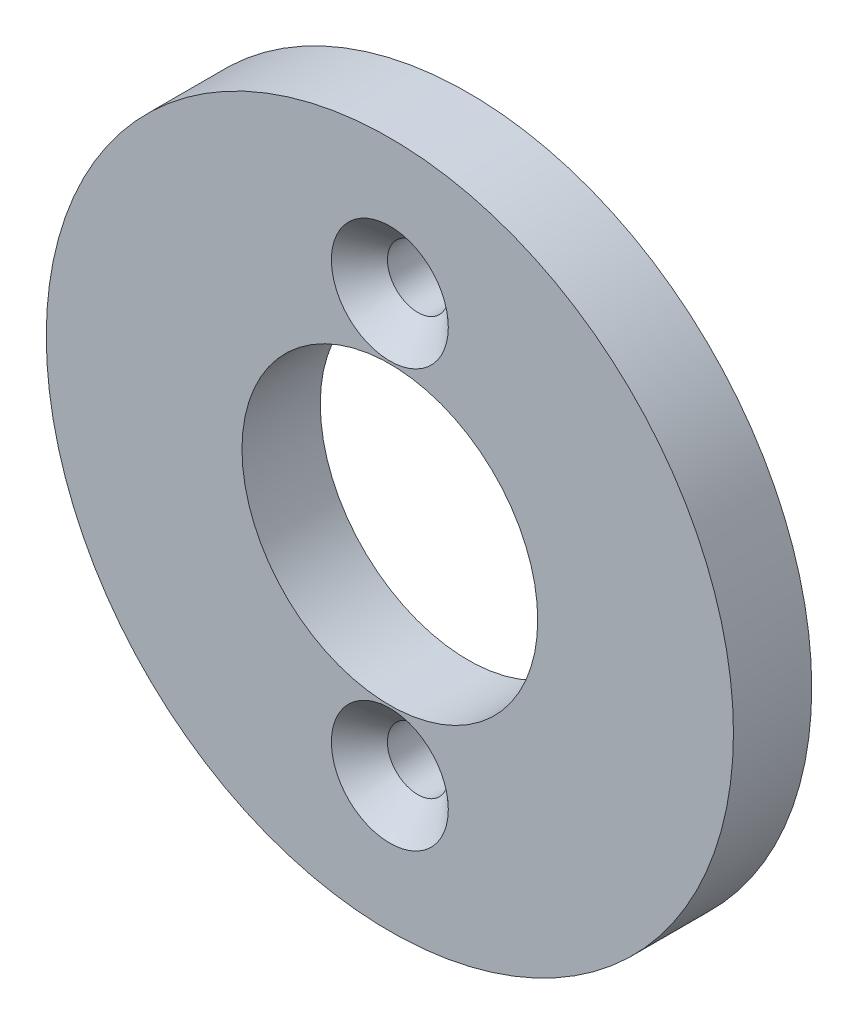
ISO-10303-21;
HEADER;
FILE_DESCRIPTION(('STEP AP214'),'2;1');
FILE_NAME('part.step','',(''),(''),'','','');
FILE_SCHEMA(('AUTOMOTIVE_DESIGN { 1 0 10303 214 1 1 1 1 }'));
ENDSEC;
DATA;
#1=APPLICATION_CONTEXT('core data for automotive mechanical design processes');
#2=APPLICATION_PROTOCOL_DEFINITION('international standard','automotive_design',2000,#1);
#3=PRODUCT_CONTEXT('',#1,'mechanical');
#4=PRODUCT('Part','Part','',(#3));
#5=PRODUCT_RELATED_PRODUCT_CATEGORY('part','',(#4));
#6=PRODUCT_DEFINITION_FORMATION('','',#4);
#7=PRODUCT_DEFINITION_CONTEXT('part definition',#1,'design');
#8=PRODUCT_DEFINITION('design','',#6,#7);
#9=PRODUCT_DEFINITION_SHAPE('','',#8);
#10=(LENGTH_UNIT() NAMED_UNIT(*) SI_UNIT(.MILLI.,.METRE.));
#11=(NAMED_UNIT(*) PLANE_ANGLE_UNIT() SI_UNIT($,.RADIAN.));
#12=(NAMED_UNIT(*) SI_UNIT($,.STERADIAN.) SOLID_ANGLE_UNIT());
#13=UNCERTAINTY_MEASURE_WITH_UNIT(LENGTH_MEASURE(1.E-05),#10,'distance_accuracy_value','');
#14=(GEOMETRIC_REPRESENTATION_CONTEXT(3) GLOBAL_UNCERTAINTY_ASSIGNED_CONTEXT((#13)) GLOBAL_UNIT_ASSIGNED_CONTEXT((#10,
#11,#12)) REPRESENTATION_CONTEXT('',''));
#15=CARTESIAN_POINT('',(0.,0.,0.));
#16=DIRECTION('',(0.,0.,1.));
#17=DIRECTION('',(1.,0.,0.));
#18=AXIS2_PLACEMENT_3D('',#15,#16,#17);
#19=CARTESIAN_POINT('',(0.,24.,-1.2E-05));
#20=DIRECTION('',(0.,0.,1.));
#21=DIRECTION('',(1.,0.,0.));
#22=AXIS2_PLACEMENT_3D('',#19,#20,#21);
#23=CYLINDRICAL_SURFACE('',#22,3.5);
#24=CARTESIAN_POINT('',(0.,24.,0.));
#25=DIRECTION('',(0.,0.,1.));
#26=DIRECTION('',(1.,0.,0.));
#27=AXIS2_PLACEMENT_3D('',#24,#25,#26);
#28=CIRCLE('',#27,3.5);
#29=CARTESIAN_POINT('',(3.5,24.,0.));
#30=VERTEX_POINT('',#29);
#31=EDGE_CURVE('E57',#30,#30,#28,.T.);
#32=CARTESIAN_POINT('',(0.,24.,5.78));
#33=DIRECTION('',(0.,0.,1.));
#34=DIRECTION('',(1.,0.,0.));
#35=AXIS2_PLACEMENT_3D('',#32,#33,#34);
#36=CIRCLE('',#35,3.5);
#37=CARTESIAN_POINT('',(3.5,24.,5.78));
#38=VERTEX_POINT('',#37);
#39=EDGE_CURVE('E79',#38,#38,#36,.T.);
#40=CARTESIAN_POINT('',(3.5,24.,0.));
#41=CARTESIAN_POINT('',(3.5,24.,0.0602083333333333));
#42=CARTESIAN_POINT('',(3.5,24.,0.120416666666667));
#43=CARTESIAN_POINT('',(3.5,24.,0.240833333333333));
#44=CARTESIAN_POINT('',(3.5,24.,0.301041666666667));
#45=CARTESIAN_POINT('',(3.5,24.,0.421458333333333));
#46=CARTESIAN_POINT('',(3.5,24.,0.481666666666667));
#47=CARTESIAN_POINT('',(3.5,24.,0.602083333333333));
#48=CARTESIAN_POINT('',(3.5,24.,0.662291666666667));
#49=CARTESIAN_POINT('',(3.5,24.,0.782708333333333));
#50=CARTESIAN_POINT('',(3.5,24.,0.842916666666667));
#51=CARTESIAN_POINT('',(3.5,24.,0.963333333333333));
#52=CARTESIAN_POINT('',(3.5,24.,1.02354166666667));
#53=CARTESIAN_POINT('',(3.5,24.,1.14395833333333));
#54=CARTESIAN_POINT('',(3.5,24.,1.20416666666667));
#55=CARTESIAN_POINT('',(3.5,24.,1.32458333333333));
#56=CARTESIAN_POINT('',(3.5,24.,1.38479166666667));
#57=CARTESIAN_POINT('',(3.5,24.,1.50520833333333));
#58=CARTESIAN_POINT('',(3.5,24.,1.56541666666667));
#59=CARTESIAN_POINT('',(3.5,24.,1.68583333333333));
#60=CARTESIAN_POINT('',(3.5,24.,1.74604166666667));
#61=CARTESIAN_POINT('',(3.5,24.,1.86645833333333));
#62=CARTESIAN_POINT('',(3.5,24.,1.92666666666667));
#63=CARTESIAN_POINT('',(3.5,24.,2.04708333333333));
#64=CARTESIAN_POINT('',(3.5,24.,2.10729166666667));
#65=CARTESIAN_POINT('',(3.5,24.,2.22770833333333));
#66=CARTESIAN_POINT('',(3.5,24.,2.28791666666667));
#67=CARTESIAN_POINT('',(3.5,24.,2.40833333333333));
#68=CARTESIAN_POINT('',(3.5,24.,2.46854166666667));
#69=CARTESIAN_POINT('',(3.5,24.,2.58895833333333));
#70=CARTESIAN_POINT('',(3.5,24.,2.64916666666667));
#71=CARTESIAN_POINT('',(3.5,24.,2.76958333333333));
#72=CARTESIAN_POINT('',(3.5,24.,2.82979166666667));
#73=CARTESIAN_POINT('',(3.5,24.,2.95020833333333));
#74=CARTESIAN_POINT('',(3.5,24.,3.01041666666667));
#75=CARTESIAN_POINT('',(3.5,24.,3.13083333333333));
#76=CARTESIAN_POINT('',(3.5,24.,3.19104166666667));
#77=CARTESIAN_POINT('',(3.5,24.,3.31145833333333));
#78=CARTESIAN_POINT('',(3.5,24.,3.37166666666667));
#79=CARTESIAN_POINT('',(3.5,24.,3.49208333333333));
#80=CARTESIAN_POINT('',(3.5,24.,3.55229166666667));
#81=CARTESIAN_POINT('',(3.5,24.,3.67270833333333));
#82=CARTESIAN_POINT('',(3.5,24.,3.73291666666667));
#83=CARTESIAN_POINT('',(3.5,24.,3.85333333333333));
#84=CARTESIAN_POINT('',(3.5,24.,3.91354166666667));
#85=CARTESIAN_POINT('',(3.5,24.,4.03395833333333));
#86=CARTESIAN_POINT('',(3.5,24.,4.09416666666667));
#87=CARTESIAN_POINT('',(3.5,24.,4.21458333333333));
#88=CARTESIAN_POINT('',(3.5,24.,4.27479166666667));
#89=CARTESIAN_POINT('',(3.5,24.,4.39520833333333));
#90=CARTESIAN_POINT('',(3.5,24.,4.45541666666667));
#91=CARTESIAN_POINT('',(3.5,24.,4.57583333333333));
#92=CARTESIAN_POINT('',(3.5,24.,4.63604166666667));
#93=CARTESIAN_POINT('',(3.5,24.,4.75645833333333));
#94=CARTESIAN_POINT('',(3.5,24.,4.81666666666667));
#95=CARTESIAN_POINT('',(3.5,24.,4.93708333333333));
#96=CARTESIAN_POINT('',(3.5,24.,4.99729166666667));
#97=CARTESIAN_POINT('',(3.5,24.,5.11770833333333));
#98=CARTESIAN_POINT('',(3.5,24.,5.17791666666667));
#99=CARTESIAN_POINT('',(3.5,24.,5.29833333333333));
#100=CARTESIAN_POINT('',(3.5,24.,5.35854166666667));
#101=CARTESIAN_POINT('',(3.5,24.,5.47895833333333));
#102=CARTESIAN_POINT('',(3.5,24.,5.53916666666667));
#103=CARTESIAN_POINT('',(3.5,24.,5.65958333333333));
#104=CARTESIAN_POINT('',(3.5,24.,5.71979166666667));
#105=CARTESIAN_POINT('',(3.5,24.,5.78));
#106=B_SPLINE_CURVE_WITH_KNOTS('',3,(#40,#41,#42,#43,#44,#45,#46,#47,#48,#49,#50,#51,#52,#53,
#54,#55,#56,#57,#58,#59,#60,#61,#62,#63,#64,#65,#66,#67,#68,#69,#70,#71,#72,#73,#74,#75,#76,#77,
#78,#79,#80,#81,#82,#83,#84,#85,#86,#87,#88,#89,#90,#91,#92,#93,#94,#95,#96,#97,#98,#99,#100,
#101,#102,#103,#104,#105),.UNSPECIFIED.,.F.,.F.,(4,2,2,2,2,2,2,2,2,2,2,2,2,2,2,2,2,2,2,2,2,2,2,
2,2,2,2,2,2,2,2,2,4),(0.,0.180625,0.36125,0.541875,0.7225,0.903125,1.08375,1.264375,1.445,
1.625625,1.80625,1.986875,2.1675,2.348125,2.52875,2.709375,2.89,3.070625,3.25125,3.431875,
3.6125,3.793125,3.97375,4.154375,4.335,4.515625,4.69625,4.876875,5.0575,5.238125,5.41875,
5.599375,5.78),.UNSPECIFIED.);
#107=EDGE_CURVE('BSEAM37',#30,#38,#106,.T.);
#108=ORIENTED_EDGE('',*,*,#31,.F.);
#109=ORIENTED_EDGE('',*,*,#39,.T.);
#110=ORIENTED_EDGE('',*,*,#107,.T.);
#111=ORIENTED_EDGE('',*,*,#107,.F.);
#112=EDGE_LOOP('',(#108,#110,#109,#111));
#113=FACE_BOUND('',#112,.T.);
#114=ADVANCED_FACE('F37',(#113),#23,.F.);
#115=CARTESIAN_POINT('',(0.,-24.,-1.2E-05));
#116=DIRECTION('',(0.,0.,1.));
#117=DIRECTION('',(1.,0.,0.));
#118=AXIS2_PLACEMENT_3D('',#115,#116,#117);
#119=CYLINDRICAL_SURFACE('',#118,3.5);
#120=CARTESIAN_POINT('',(0.,-24.,0.));
#121=DIRECTION('',(0.,0.,1.));
#122=DIRECTION('',(1.,0.,0.));
#123=AXIS2_PLACEMENT_3D('',#120,#121,#122);
#124=CIRCLE('',#123,3.5);
#125=CARTESIAN_POINT('',(3.5,-24.,0.));
#126=VERTEX_POINT('',#125);
#127=EDGE_CURVE('E41',#126,#126,#124,.T.);
#128=CARTESIAN_POINT('',(0.,-24.,5.78));
#129=DIRECTION('',(0.,0.,1.));
#130=DIRECTION('',(1.,0.,0.));
#131=AXIS2_PLACEMENT_3D('',#128,#129,#130);
#132=CIRCLE('',#131,3.5);
#133=CARTESIAN_POINT('',(3.5,-24.,5.78));
#134=VERTEX_POINT('',#133);
#135=EDGE_CURVE('E72',#134,#134,#132,.T.);
#136=CARTESIAN_POINT('',(3.5,-24.,0.));
#137=CARTESIAN_POINT('',(3.5,-24.,0.0602083333333333));
#138=CARTESIAN_POINT('',(3.5,-24.,0.120416666666667));
#139=CARTESIAN_POINT('',(3.5,-24.,0.240833333333333));
#140=CARTESIAN_POINT('',(3.5,-24.,0.301041666666667));
#141=CARTESIAN_POINT('',(3.5,-24.,0.421458333333333));
#142=CARTESIAN_POINT('',(3.5,-24.,0.481666666666667));
#143=CARTESIAN_POINT('',(3.5,-24.,0.602083333333333));
#144=CARTESIAN_POINT('',(3.5,-24.,0.662291666666667));
#145=CARTESIAN_POINT('',(3.5,-24.,0.782708333333333));
#146=CARTESIAN_POINT('',(3.5,-24.,0.842916666666667));
#147=CARTESIAN_POINT('',(3.5,-24.,0.963333333333333));
#148=CARTESIAN_POINT('',(3.5,-24.,1.02354166666667));
#149=CARTESIAN_POINT('',(3.5,-24.,1.14395833333333));
#150=CARTESIAN_POINT('',(3.5,-24.,1.20416666666667));
#151=CARTESIAN_POINT('',(3.5,-24.,1.32458333333333));
#152=CARTESIAN_POINT('',(3.5,-24.,1.38479166666667));
#153=CARTESIAN_POINT('',(3.5,-24.,1.50520833333333));
#154=CARTESIAN_POINT('',(3.5,-24.,1.56541666666667));
#155=CARTESIAN_POINT('',(3.5,-24.,1.68583333333333));
#156=CARTESIAN_POINT('',(3.5,-24.,1.74604166666667));
#157=CARTESIAN_POINT('',(3.5,-24.,1.86645833333333));
#158=CARTESIAN_POINT('',(3.5,-24.,1.92666666666667));
#159=CARTESIAN_POINT('',(3.5,-24.,2.04708333333333));
#160=CARTESIAN_POINT('',(3.5,-24.,2.10729166666667));
#161=CARTESIAN_POINT('',(3.5,-24.,2.22770833333333));
#162=CARTESIAN_POINT('',(3.5,-24.,2.28791666666667));
#163=CARTESIAN_POINT('',(3.5,-24.,2.40833333333333));
#164=CARTESIAN_POINT('',(3.5,-24.,2.46854166666667));
#165=CARTESIAN_POINT('',(3.5,-24.,2.58895833333333));
#166=CARTESIAN_POINT('',(3.5,-24.,2.64916666666667));
#167=CARTESIAN_POINT('',(3.5,-24.,2.76958333333333));
#168=CARTESIAN_POINT('',(3.5,-24.,2.82979166666667));
#169=CARTESIAN_POINT('',(3.5,-24.,2.95020833333333));
#170=CARTESIAN_POINT('',(3.5,-24.,3.01041666666667));
#171=CARTESIAN_POINT('',(3.5,-24.,3.13083333333333));
#172=CARTESIAN_POINT('',(3.5,-24.,3.19104166666667));
#173=CARTESIAN_POINT('',(3.5,-24.,3.31145833333333));
#174=CARTESIAN_POINT('',(3.5,-24.,3.37166666666667));
#175=CARTESIAN_POINT('',(3.5,-24.,3.49208333333333));
#176=CARTESIAN_POINT('',(3.5,-24.,3.55229166666667));
#177=CARTESIAN_POINT('',(3.5,-24.,3.67270833333333));
#178=CARTESIAN_POINT('',(3.5,-24.,3.73291666666667));
#179=CARTESIAN_POINT('',(3.5,-24.,3.85333333333333));
#180=CARTESIAN_POINT('',(3.5,-24.,3.91354166666667));
#181=CARTESIAN_POINT('',(3.5,-24.,4.03395833333333));
#182=CARTESIAN_POINT('',(3.5,-24.,4.09416666666667));
#183=CARTESIAN_POINT('',(3.5,-24.,4.21458333333333));
#184=CARTESIAN_POINT('',(3.5,-24.,4.27479166666667));
#185=CARTESIAN_POINT('',(3.5,-24.,4.39520833333333));
#186=CARTESIAN_POINT('',(3.5,-24.,4.45541666666667));
#187=CARTESIAN_POINT('',(3.5,-24.,4.57583333333333));
#188=CARTESIAN_POINT('',(3.5,-24.,4.63604166666667));
#189=CARTESIAN_POINT('',(3.5,-24.,4.75645833333333));
#190=CARTESIAN_POINT('',(3.5,-24.,4.81666666666667));
#191=CARTESIAN_POINT('',(3.5,-24.,4.93708333333333));
#192=CARTESIAN_POINT('',(3.5,-24.,4.99729166666667));
#193=CARTESIAN_POINT('',(3.5,-24.,5.11770833333333));
#194=CARTESIAN_POINT('',(3.5,-24.,5.17791666666667));
#195=CARTESIAN_POINT('',(3.5,-24.,5.29833333333333));
#196=CARTESIAN_POINT('',(3.5,-24.,5.35854166666667));
#197=CARTESIAN_POINT('',(3.5,-24.,5.47895833333333));
#198=CARTESIAN_POINT('',(3.5,-24.,5.53916666666667));
#199=CARTESIAN_POINT('',(3.5,-24.,5.65958333333333));
#200=CARTESIAN_POINT('',(3.5,-24.,5.71979166666667));
#201=CARTESIAN_POINT('',(3.5,-24.,5.78));
#202=B_SPLINE_CURVE_WITH_KNOTS('',3,(#136,#137,#138,#139,#140,#141,#142,#143,#144,#145,#146,
#147,#148,#149,#150,#151,#152,#153,#154,#155,#156,#157,#158,#159,#160,#161,#162,#163,#164,#165,
#166,#167,#168,#169,#170,#171,#172,#173,#174,#175,#176,#177,#178,#179,#180,#181,#182,#183,#184,
#185,#186,#187,#188,#189,#190,#191,#192,#193,#194,#195,#196,#197,#198,#199,#200,#201),
.UNSPECIFIED.,.F.,.F.,(4,2,2,2,2,2,2,2,2,2,2,2,2,2,2,2,2,2,2,2,2,2,2,2,2,2,2,2,2,2,2,2,4),(0.,
0.180625,0.36125,0.541875,0.7225,0.903125,1.08375,1.264375,1.445,1.625625,1.80625,1.986875,
2.1675,2.348125,2.52875,2.709375,2.89,3.070625,3.25125,3.431875,3.6125,3.793125,3.97375,
4.154375,4.335,4.515625,4.69625,4.876875,5.0575,5.238125,5.41875,5.599375,5.78),.UNSPECIFIED.);
#203=EDGE_CURVE('BSEAM66',#126,#134,#202,.T.);
#204=ORIENTED_EDGE('',*,*,#127,.F.);
#205=ORIENTED_EDGE('',*,*,#135,.T.);
#206=ORIENTED_EDGE('',*,*,#203,.T.);
#207=ORIENTED_EDGE('',*,*,#203,.F.);
#208=EDGE_LOOP('',(#204,#206,#205,#207));
#209=FACE_BOUND('',#208,.T.);
#210=ADVANCED_FACE('F66',(#209),#119,.F.);
#211=CARTESIAN_POINT('',(0.,0.,9.));
#212=DIRECTION('',(0.,0.,-1.));
#213=DIRECTION('',(-1.,0.,0.));
#214=AXIS2_PLACEMENT_3D('',#211,#212,#213);
#215=CYLINDRICAL_SURFACE('',#214,39.5);
#216=CARTESIAN_POINT('',(0.,0.,9.));
#217=DIRECTION('',(0.,0.,1.));
#218=DIRECTION('',(1.,0.,0.));
#219=AXIS2_PLACEMENT_3D('',#216,#217,#218);
#220=CIRCLE('',#219,39.5);
#221=CARTESIAN_POINT('',(39.5,0.,9.));
#222=VERTEX_POINT('',#221);
#223=EDGE_CURVE('E10',#222,#222,#220,.T.);
#224=ORIENTED_EDGE('',*,*,#223,.F.);
#225=EDGE_LOOP('',(#224));
#226=FACE_BOUND('',#225,.T.);
#227=CARTESIAN_POINT('',(0.,0.,0.));
#228=DIRECTION('',(0.,0.,1.));
#229=DIRECTION('',(1.,0.,0.));
#230=AXIS2_PLACEMENT_3D('',#227,#228,#229);
#231=CIRCLE('',#230,39.5);
#232=CARTESIAN_POINT('',(39.5,0.,0.));
#233=VERTEX_POINT('',#232);
#234=EDGE_CURVE('E45',#233,#233,#231,.T.);
#235=ORIENTED_EDGE('',*,*,#234,.T.);
#236=EDGE_LOOP('',(#235));
#237=FACE_BOUND('',#236,.T.);
#238=ADVANCED_FACE('F39',(#226,#237),#215,.T.);
#239=CARTESIAN_POINT('',(0.,0.,9.));
#240=DIRECTION('',(0.,0.,1.));
#241=DIRECTION('',(1.,0.,0.));
#242=AXIS2_PLACEMENT_3D('',#239,#240,#241);
#243=PLANE('',#242);
#244=CARTESIAN_POINT('',(0.,24.,9.));
#245=DIRECTION('',(0.,0.,1.));
#246=DIRECTION('',(1.,0.,0.));
#247=AXIS2_PLACEMENT_3D('',#244,#245,#246);
#248=CIRCLE('',#247,6.72);
#249=CARTESIAN_POINT('',(6.72,24.,9.));
#250=VERTEX_POINT('',#249);
#251=EDGE_CURVE('E77',#250,#250,#248,.T.);
#252=ORIENTED_EDGE('',*,*,#251,.F.);
#253=EDGE_LOOP('',(#252));
#254=FACE_BOUND('',#253,.T.);
#255=CARTESIAN_POINT('',(0.,-24.,9.));
#256=DIRECTION('',(0.,0.,1.));
#257=DIRECTION('',(1.,0.,0.));
#258=AXIS2_PLACEMENT_3D('',#255,#256,#257);
#259=CIRCLE('',#258,6.72);
#260=CARTESIAN_POINT('',(6.72,-24.,9.));
#261=VERTEX_POINT('',#260);
#262=EDGE_CURVE('E74',#261,#261,#259,.T.);
#263=ORIENTED_EDGE('',*,*,#262,.F.);
#264=EDGE_LOOP('',(#263));
#265=FACE_BOUND('',#264,.T.);
#266=CARTESIAN_POINT('',(0.,0.,9.));
#267=DIRECTION('',(0.,0.,1.));
#268=DIRECTION('',(1.,0.,0.));
#269=AXIS2_PLACEMENT_3D('',#266,#267,#268);
#270=CIRCLE('',#269,17.);
#271=CARTESIAN_POINT('',(17.,0.,9.));
#272=VERTEX_POINT('',#271);
#273=EDGE_CURVE('E52',#272,#272,#270,.T.);
#274=ORIENTED_EDGE('',*,*,#273,.F.);
#275=EDGE_LOOP('',(#274));
#276=FACE_BOUND('',#275,.T.);
#277=ORIENTED_EDGE('',*,*,#223,.T.);
#278=EDGE_LOOP('',(#277));
#279=FACE_BOUND('',#278,.T.);
#280=ADVANCED_FACE('F87',(#254,#265,#276,#279),#243,.T.);
#281=CARTESIAN_POINT('',(0.,0.,0.));
#282=DIRECTION('',(0.,0.,1.));
#283=DIRECTION('',(1.,0.,0.));
#284=AXIS2_PLACEMENT_3D('',#281,#282,#283);
#285=PLANE('',#284);
#286=ORIENTED_EDGE('',*,*,#127,.T.);
#287=EDGE_LOOP('',(#286));
#288=FACE_BOUND('',#287,.T.);
#289=ORIENTED_EDGE('',*,*,#31,.T.);
#290=EDGE_LOOP('',(#289));
#291=FACE_BOUND('',#290,.T.);
#292=CARTESIAN_POINT('',(0.,0.,0.));
#293=DIRECTION('',(0.,0.,1.));
#294=DIRECTION('',(1.,0.,0.));
#295=AXIS2_PLACEMENT_3D('',#292,#293,#294);
#296=CIRCLE('',#295,17.);
#297=CARTESIAN_POINT('',(17.,0.,0.));
#298=VERTEX_POINT('',#297);
#299=EDGE_CURVE('E55',#298,#298,#296,.T.);
#300=ORIENTED_EDGE('',*,*,#299,.T.);
#301=EDGE_LOOP('',(#300));
#302=FACE_BOUND('',#301,.T.);
#303=ORIENTED_EDGE('',*,*,#234,.F.);
#304=EDGE_LOOP('',(#303));
#305=FACE_BOUND('',#304,.T.);
#306=ADVANCED_FACE('F64',(#288,#291,#302,#305),#285,.F.);
#307=CARTESIAN_POINT('',(0.,0.,-1.2E-05));
#308=DIRECTION('',(0.,0.,1.));
#309=DIRECTION('',(1.,0.,0.));
#310=AXIS2_PLACEMENT_3D('',#307,#308,#309);
#311=CYLINDRICAL_SURFACE('',#310,17.);
#312=CARTESIAN_POINT('',(17.,0.,9.));
#313=CARTESIAN_POINT('',(17.,0.,8.90625));
#314=CARTESIAN_POINT('',(17.,0.,8.8125));
#315=CARTESIAN_POINT('',(17.,0.,8.625));
#316=CARTESIAN_POINT('',(17.,0.,8.53125));
#317=CARTESIAN_POINT('',(17.,0.,8.34375));
#318=CARTESIAN_POINT('',(17.,0.,8.25));
#319=CARTESIAN_POINT('',(17.,0.,8.0625));
#320=CARTESIAN_POINT('',(17.,0.,7.96875));
#321=CARTESIAN_POINT('',(17.,0.,7.78125));
#322=CARTESIAN_POINT('',(17.,0.,7.6875));
#323=CARTESIAN_POINT('',(17.,0.,7.5));
#324=CARTESIAN_POINT('',(17.,0.,7.40625));
#325=CARTESIAN_POINT('',(17.,0.,7.21875));
#326=CARTESIAN_POINT('',(17.,0.,7.125));
#327=CARTESIAN_POINT('',(17.,0.,6.9375));
#328=CARTESIAN_POINT('',(17.,0.,6.84375));
#329=CARTESIAN_POINT('',(17.,0.,6.65625));
#330=CARTESIAN_POINT('',(17.,0.,6.5625));
#331=CARTESIAN_POINT('',(17.,0.,6.375));
#332=CARTESIAN_POINT('',(17.,0.,6.28125));
#333=CARTESIAN_POINT('',(17.,0.,6.09375));
#334=CARTESIAN_POINT('',(17.,0.,6.));
#335=CARTESIAN_POINT('',(17.,0.,5.8125));
#336=CARTESIAN_POINT('',(17.,0.,5.71875));
#337=CARTESIAN_POINT('',(17.,0.,5.53125));
#338=CARTESIAN_POINT('',(17.,0.,5.4375));
#339=CARTESIAN_POINT('',(17.,0.,5.25));
#340=CARTESIAN_POINT('',(17.,0.,5.15625));
#341=CARTESIAN_POINT('',(17.,0.,4.96875));
#342=CARTESIAN_POINT('',(17.,0.,4.875));
#343=CARTESIAN_POINT('',(17.,0.,4.6875));
#344=CARTESIAN_POINT('',(17.,0.,4.59375));
#345=CARTESIAN_POINT('',(17.,0.,4.40625));
#346=CARTESIAN_POINT('',(17.,0.,4.3125));
#347=CARTESIAN_POINT('',(17.,0.,4.125));
#348=CARTESIAN_POINT('',(17.,0.,4.03125));
#349=CARTESIAN_POINT('',(17.,0.,3.84375));
#350=CARTESIAN_POINT('',(17.,0.,3.75));
#351=CARTESIAN_POINT('',(17.,0.,3.5625));
#352=CARTESIAN_POINT('',(17.,0.,3.46875));
#353=CARTESIAN_POINT('',(17.,0.,3.28125));
#354=CARTESIAN_POINT('',(17.,0.,3.1875));
#355=CARTESIAN_POINT('',(17.,0.,3.));
#356=CARTESIAN_POINT('',(17.,0.,2.90625));
#357=CARTESIAN_POINT('',(17.,0.,2.71875));
#358=CARTESIAN_POINT('',(17.,0.,2.625));
#359=CARTESIAN_POINT('',(17.,0.,2.4375));
#360=CARTESIAN_POINT('',(17.,0.,2.34375));
#361=CARTESIAN_POINT('',(17.,0.,2.15625));
#362=CARTESIAN_POINT('',(17.,0.,2.0625));
#363=CARTESIAN_POINT('',(17.,0.,1.875));
#364=CARTESIAN_POINT('',(17.,0.,1.78125));
#365=CARTESIAN_POINT('',(17.,0.,1.59375));
#366=CARTESIAN_POINT('',(17.,0.,1.5));
#367=CARTESIAN_POINT('',(17.,0.,1.3125));
#368=CARTESIAN_POINT('',(17.,0.,1.21875));
#369=CARTESIAN_POINT('',(17.,0.,1.03125));
#370=CARTESIAN_POINT('',(17.,0.,0.937500000000001));
#371=CARTESIAN_POINT('',(17.,0.,0.750000000000001));
#372=CARTESIAN_POINT('',(17.,0.,0.656250000000001));
#373=CARTESIAN_POINT('',(17.,0.,0.468750000000001));
#374=CARTESIAN_POINT('',(17.,0.,0.375000000000001));
#375=CARTESIAN_POINT('',(17.,0.,0.187500000000001));
#376=CARTESIAN_POINT('',(17.,0.,0.0937500000000007));
#377=CARTESIAN_POINT('',(17.,0.,0.));
#378=B_SPLINE_CURVE_WITH_KNOTS('',3,(#312,#313,#314,#315,#316,#317,#318,#319,#320,#321,#322,
#323,#324,#325,#326,#327,#328,#329,#330,#331,#332,#333,#334,#335,#336,#337,#338,#339,#340,#341,
#342,#343,#344,#345,#346,#347,#348,#349,#350,#351,#352,#353,#354,#355,#356,#357,#358,#359,#360,
#361,#362,#363,#364,#365,#366,#367,#368,#369,#370,#371,#372,#373,#374,#375,#376,#377),
.UNSPECIFIED.,.F.,.F.,(4,2,2,2,2,2,2,2,2,2,2,2,2,2,2,2,2,2,2,2,2,2,2,2,2,2,2,2,2,2,2,2,4),(0.,
0.28125,0.5625,0.843750000000001,1.125,1.40625,1.6875,1.96875,2.25,2.53125,2.8125,3.09375,3.375,
3.65625,3.9375,4.21875,4.5,4.78125,5.0625,5.34375,5.625,5.90625,6.1875,6.46875,6.75,7.03125,
7.3125,7.59375,7.875,8.15625,8.4375,8.71875,9.),.UNSPECIFIED.);
#379=EDGE_CURVE('BSEAM96',#272,#298,#378,.T.);
#380=ORIENTED_EDGE('',*,*,#273,.T.);
#381=ORIENTED_EDGE('',*,*,#299,.F.);
#382=ORIENTED_EDGE('',*,*,#379,.T.);
#383=ORIENTED_EDGE('',*,*,#379,.F.);
#384=EDGE_LOOP('',(#380,#382,#381,#383));
#385=FACE_BOUND('',#384,.T.);
#386=ADVANCED_FACE('F96',(#385),#311,.F.);
#387=CARTESIAN_POINT('',(0.,-24.,9.));
#388=DIRECTION('',(0.,0.,1.));
#389=DIRECTION('',(1.,0.,0.));
#390=AXIS2_PLACEMENT_3D('',#387,#388,#389);
#391=CONICAL_SURFACE('',#390,6.72,0.785398163397448);
#392=ORIENTED_EDGE('',*,*,#135,.F.);
#393=EDGE_LOOP('',(#392));
#394=FACE_BOUND('',#393,.T.);
#395=ORIENTED_EDGE('',*,*,#262,.T.);
#396=EDGE_LOOP('',(#395));
#397=FACE_BOUND('',#396,.T.);
#398=ADVANCED_FACE('F99',(#394,#397),#391,.F.);
#399=CARTESIAN_POINT('',(0.,24.,9.));
#400=DIRECTION('',(0.,0.,1.));
#401=DIRECTION('',(1.,0.,0.));
#402=AXIS2_PLACEMENT_3D('',#399,#400,#401);
#403=CONICAL_SURFACE('',#402,6.72,0.785398163397448);
#404=ORIENTED_EDGE('',*,*,#39,.F.);
#405=EDGE_LOOP('',(#404));
#406=FACE_BOUND('',#405,.T.);
#407=ORIENTED_EDGE('',*,*,#251,.T.);
#408=EDGE_LOOP('',(#407));
#409=FACE_BOUND('',#408,.T.);
#410=ADVANCED_FACE('F85',(#406,#409),#403,.F.);
#411=CLOSED_SHELL('',(#114,#210,#238,#280,#306,#386,#398,#410));
#412=MANIFOLD_SOLID_BREP('B2',#411);
#413=ADVANCED_BREP_SHAPE_REPRESENTATION('',(#18,#412),#14);
#414=SHAPE_DEFINITION_REPRESENTATION(#9,#413);
ENDSEC;
END-ISO-10303-21;
